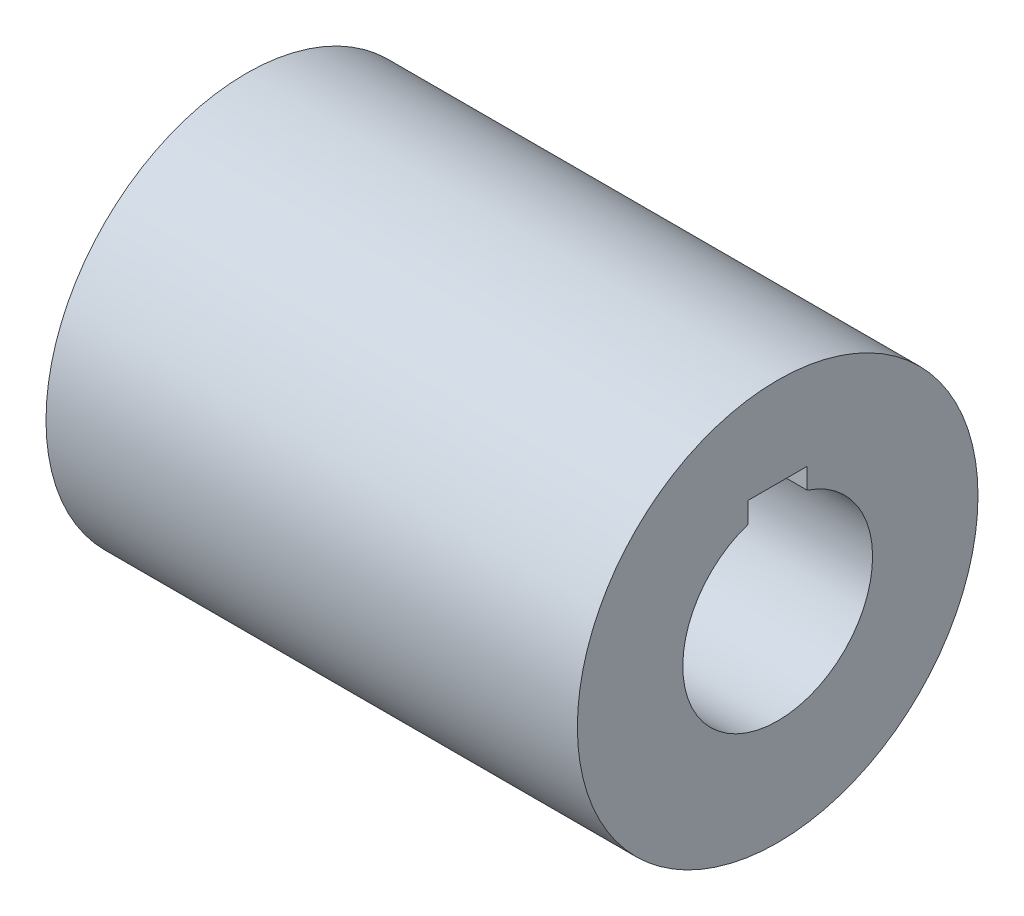
ISO-10303-21;
HEADER;
FILE_DESCRIPTION(('STEP AP214'),'2;1');
FILE_NAME('part.step','',(''),(''),'','','');
FILE_SCHEMA(('AUTOMOTIVE_DESIGN { 1 0 10303 214 1 1 1 1 }'));
ENDSEC;
DATA;
#1=APPLICATION_CONTEXT('core data for automotive mechanical design processes');
#2=APPLICATION_PROTOCOL_DEFINITION('international standard','automotive_design',2000,#1);
#3=PRODUCT_CONTEXT('',#1,'mechanical');
#4=PRODUCT('Part','Part','',(#3));
#5=PRODUCT_RELATED_PRODUCT_CATEGORY('part','',(#4));
#6=PRODUCT_DEFINITION_FORMATION('','',#4);
#7=PRODUCT_DEFINITION_CONTEXT('part definition',#1,'design');
#8=PRODUCT_DEFINITION('design','',#6,#7);
#9=PRODUCT_DEFINITION_SHAPE('','',#8);
#10=(LENGTH_UNIT() NAMED_UNIT(*) SI_UNIT(.MILLI.,.METRE.));
#11=(NAMED_UNIT(*) PLANE_ANGLE_UNIT() SI_UNIT($,.RADIAN.));
#12=(NAMED_UNIT(*) SI_UNIT($,.STERADIAN.) SOLID_ANGLE_UNIT());
#13=UNCERTAINTY_MEASURE_WITH_UNIT(LENGTH_MEASURE(1.E-05),#10,'distance_accuracy_value','');
#14=(GEOMETRIC_REPRESENTATION_CONTEXT(3) GLOBAL_UNCERTAINTY_ASSIGNED_CONTEXT((#13)) GLOBAL_UNIT_ASSIGNED_CONTEXT((#10,
#11,#12)) REPRESENTATION_CONTEXT('',''));
#15=CARTESIAN_POINT('',(0.,0.,0.));
#16=DIRECTION('',(0.,0.,1.));
#17=DIRECTION('',(1.,0.,0.));
#18=AXIS2_PLACEMENT_3D('',#15,#16,#17);
#19=CARTESIAN_POINT('',(63.,0.,0.));
#20=DIRECTION('',(1.,0.,0.));
#21=DIRECTION('',(0.,0.,-1.));
#22=AXIS2_PLACEMENT_3D('',#19,#20,#21);
#23=PLANE('',#22);
#24=CARTESIAN_POINT('',(63.,0.,0.));
#25=DIRECTION('',(1.,0.,0.));
#26=DIRECTION('',(0.,0.,-1.));
#27=AXIS2_PLACEMENT_3D('',#24,#25,#26);
#28=CIRCLE('',#27,47.5);
#29=CARTESIAN_POINT('',(63.,0.,-47.5));
#30=VERTEX_POINT('',#29);
#31=EDGE_CURVE('E11',#30,#30,#28,.T.);
#32=ORIENTED_EDGE('',*,*,#31,.T.);
#33=EDGE_LOOP('',(#32));
#34=FACE_BOUND('',#33,.T.);
#35=CARTESIAN_POINT('',(63.,0.,0.));
#36=DIRECTION('',(1.,0.,0.));
#37=DIRECTION('',(0.,0.,-1.));
#38=AXIS2_PLACEMENT_3D('',#35,#36,#37);
#39=CIRCLE('',#38,22.5);
#40=CARTESIAN_POINT('',(63.,21.3834047803431,7.));
#41=VERTEX_POINT('',#40);
#42=CARTESIAN_POINT('',(63.,21.3834047803431,-7.));
#43=VERTEX_POINT('',#42);
#44=EDGE_CURVE('E119',#41,#43,#39,.T.);
#45=ORIENTED_EDGE('',*,*,#44,.F.);
#46=DIRECTION('',(0.,-1.,0.));
#47=VECTOR('',#46,1.);
#48=CARTESIAN_POINT('',(63.,21.3834047803431,7.));
#49=LINE('',#48,#47);
#50=CARTESIAN_POINT('',(63.,26.3034047803431,7.));
#51=VERTEX_POINT('',#50);
#52=EDGE_CURVE('E108',#51,#41,#49,.T.);
#53=ORIENTED_EDGE('',*,*,#52,.F.);
#54=DIRECTION('',(0.,0.,1.));
#55=VECTOR('',#54,1.);
#56=CARTESIAN_POINT('',(63.,26.3034047803431,7.));
#57=LINE('',#56,#55);
#58=CARTESIAN_POINT('',(63.,26.3034047803431,-7.));
#59=VERTEX_POINT('',#58);
#60=EDGE_CURVE('E133',#59,#51,#57,.T.);
#61=ORIENTED_EDGE('',*,*,#60,.F.);
#62=DIRECTION('',(0.,1.,0.));
#63=VECTOR('',#62,1.);
#64=CARTESIAN_POINT('',(63.,26.3034047803431,-7.));
#65=LINE('',#64,#63);
#66=EDGE_CURVE('E131',#43,#59,#65,.T.);
#67=ORIENTED_EDGE('',*,*,#66,.F.);
#68=EDGE_LOOP('',(#45,#53,#61,#67));
#69=FACE_BOUND('',#68,.T.);
#70=ADVANCED_FACE('F41',(#34,#69),#23,.T.);
#71=CARTESIAN_POINT('',(63.,0.,0.));
#72=DIRECTION('',(-1.,0.,0.));
#73=DIRECTION('',(0.,0.,1.));
#74=AXIS2_PLACEMENT_3D('',#71,#72,#73);
#75=CYLINDRICAL_SURFACE('',#74,47.5);
#76=ORIENTED_EDGE('',*,*,#31,.F.);
#77=EDGE_LOOP('',(#76));
#78=FACE_BOUND('',#77,.T.);
#79=CARTESIAN_POINT('',(-63.,0.,0.));
#80=DIRECTION('',(1.,0.,0.));
#81=DIRECTION('',(0.,0.,-1.));
#82=AXIS2_PLACEMENT_3D('',#79,#80,#81);
#83=CIRCLE('',#82,47.5);
#84=CARTESIAN_POINT('',(-63.,0.,-47.5));
#85=VERTEX_POINT('',#84);
#86=EDGE_CURVE('E45',#85,#85,#83,.T.);
#87=ORIENTED_EDGE('',*,*,#86,.T.);
#88=EDGE_LOOP('',(#87));
#89=FACE_BOUND('',#88,.T.);
#90=ADVANCED_FACE('F43',(#78,#89),#75,.T.);
#91=CARTESIAN_POINT('',(-63.,0.,0.));
#92=DIRECTION('',(1.,0.,0.));
#93=DIRECTION('',(0.,0.,-1.));
#94=AXIS2_PLACEMENT_3D('',#91,#92,#93);
#95=PLANE('',#94);
#96=DIRECTION('',(0.,-1.,0.));
#97=VECTOR('',#96,1.);
#98=CARTESIAN_POINT('',(-63.,26.3106442338457,8.));
#99=LINE('',#98,#97);
#100=CARTESIAN_POINT('',(-63.,31.8,8.));
#101=VERTEX_POINT('',#100);
#102=CARTESIAN_POINT('',(-63.,26.3106442338457,8.));
#103=VERTEX_POINT('',#102);
#104=EDGE_CURVE('E154',#101,#103,#99,.T.);
#105=ORIENTED_EDGE('',*,*,#104,.T.);
#106=CARTESIAN_POINT('',(-63.,0.,0.));
#107=DIRECTION('',(1.,0.,0.));
#108=DIRECTION('',(0.,0.,-1.));
#109=AXIS2_PLACEMENT_3D('',#106,#107,#108);
#110=CIRCLE('',#109,27.5);
#111=CARTESIAN_POINT('',(-63.,26.3106442338457,-8.));
#112=VERTEX_POINT('',#111);
#113=EDGE_CURVE('E146',#103,#112,#110,.T.);
#114=ORIENTED_EDGE('',*,*,#113,.T.);
#115=DIRECTION('',(0.,1.,0.));
#116=VECTOR('',#115,1.);
#117=CARTESIAN_POINT('',(-63.,31.8,-8.));
#118=LINE('',#117,#116);
#119=CARTESIAN_POINT('',(-63.,31.8,-8.));
#120=VERTEX_POINT('',#119);
#121=EDGE_CURVE('E149',#112,#120,#118,.T.);
#122=ORIENTED_EDGE('',*,*,#121,.T.);
#123=DIRECTION('',(0.,0.,1.));
#124=VECTOR('',#123,1.);
#125=CARTESIAN_POINT('',(-63.,31.8,8.));
#126=LINE('',#125,#124);
#127=EDGE_CURVE('E64',#120,#101,#126,.T.);
#128=ORIENTED_EDGE('',*,*,#127,.T.);
#129=EDGE_LOOP('',(#105,#114,#122,#128));
#130=FACE_BOUND('',#129,.T.);
#131=ORIENTED_EDGE('',*,*,#86,.F.);
#132=EDGE_LOOP('',(#131));
#133=FACE_BOUND('',#132,.T.);
#134=ADVANCED_FACE('F191',(#130,#133),#95,.F.);
#135=CARTESIAN_POINT('',(-63.,0.,0.));
#136=DIRECTION('',(1.,0.,0.));
#137=DIRECTION('',(0.,0.,-1.));
#138=AXIS2_PLACEMENT_3D('',#135,#136,#137);
#139=CYLINDRICAL_SURFACE('',#138,27.5);
#140=CARTESIAN_POINT('',(-13.,0.,0.));
#141=DIRECTION('',(1.,0.,0.));
#142=DIRECTION('',(0.,0.,-1.));
#143=AXIS2_PLACEMENT_3D('',#140,#141,#142);
#144=CIRCLE('',#143,27.5);
#145=CARTESIAN_POINT('',(-13.,26.3106442338457,8.));
#146=VERTEX_POINT('',#145);
#147=CARTESIAN_POINT('',(-13.,26.3106442338457,-8.));
#148=VERTEX_POINT('',#147);
#149=EDGE_CURVE('E127',#146,#148,#144,.T.);
#150=ORIENTED_EDGE('',*,*,#149,.T.);
#151=DIRECTION('',(1.,0.,0.));
#152=VECTOR('',#151,1.);
#153=CARTESIAN_POINT('',(-63.,26.3106442338457,-8.));
#154=LINE('',#153,#152);
#155=EDGE_CURVE('E157',#112,#148,#154,.T.);
#156=ORIENTED_EDGE('',*,*,#155,.F.);
#157=ORIENTED_EDGE('',*,*,#113,.F.);
#158=DIRECTION('',(1.,0.,0.));
#159=VECTOR('',#158,1.);
#160=CARTESIAN_POINT('',(-63.,26.3106442338457,8.));
#161=LINE('',#160,#159);
#162=EDGE_CURVE('E168',#103,#146,#161,.T.);
#163=ORIENTED_EDGE('',*,*,#162,.T.);
#164=EDGE_LOOP('',(#150,#156,#157,#163));
#165=FACE_BOUND('',#164,.T.);
#166=ADVANCED_FACE('F185',(#165),#139,.F.);
#167=CARTESIAN_POINT('',(-63.,26.3106442338457,8.));
#168=DIRECTION('',(0.,0.,1.));
#169=DIRECTION('',(1.,0.,0.));
#170=AXIS2_PLACEMENT_3D('',#167,#168,#169);
#171=PLANE('',#170);
#172=DIRECTION('',(0.,-1.,0.));
#173=VECTOR('',#172,1.);
#174=CARTESIAN_POINT('',(-13.,26.3106442338457,8.));
#175=LINE('',#174,#173);
#176=CARTESIAN_POINT('',(-13.,31.8,8.));
#177=VERTEX_POINT('',#176);
#178=EDGE_CURVE('E150',#177,#146,#175,.T.);
#179=ORIENTED_EDGE('',*,*,#178,.T.);
#180=ORIENTED_EDGE('',*,*,#162,.F.);
#181=ORIENTED_EDGE('',*,*,#104,.F.);
#182=DIRECTION('',(1.,0.,0.));
#183=VECTOR('',#182,1.);
#184=CARTESIAN_POINT('',(-63.,31.8,8.));
#185=LINE('',#184,#183);
#186=EDGE_CURVE('E170',#101,#177,#185,.T.);
#187=ORIENTED_EDGE('',*,*,#186,.T.);
#188=EDGE_LOOP('',(#179,#180,#181,#187));
#189=FACE_BOUND('',#188,.T.);
#190=ADVANCED_FACE('F188',(#189),#171,.F.);
#191=CARTESIAN_POINT('',(-63.,31.8,8.));
#192=DIRECTION('',(0.,1.,0.));
#193=DIRECTION('',(0.,0.,1.));
#194=AXIS2_PLACEMENT_3D('',#191,#192,#193);
#195=PLANE('',#194);
#196=DIRECTION('',(0.,0.,1.));
#197=VECTOR('',#196,1.);
#198=CARTESIAN_POINT('',(-13.,31.8,8.));
#199=LINE('',#198,#197);
#200=CARTESIAN_POINT('',(-13.,31.8,-8.));
#201=VERTEX_POINT('',#200);
#202=EDGE_CURVE('E163',#201,#177,#199,.T.);
#203=ORIENTED_EDGE('',*,*,#202,.T.);
#204=ORIENTED_EDGE('',*,*,#186,.F.);
#205=ORIENTED_EDGE('',*,*,#127,.F.);
#206=DIRECTION('',(1.,0.,0.));
#207=VECTOR('',#206,1.);
#208=CARTESIAN_POINT('',(-63.,31.8,-8.));
#209=LINE('',#208,#207);
#210=EDGE_CURVE('E172',#120,#201,#209,.T.);
#211=ORIENTED_EDGE('',*,*,#210,.T.);
#212=EDGE_LOOP('',(#203,#204,#205,#211));
#213=FACE_BOUND('',#212,.T.);
#214=ADVANCED_FACE('F189',(#213),#195,.F.);
#215=CARTESIAN_POINT('',(-63.,31.8,-8.));
#216=DIRECTION('',(0.,0.,-1.));
#217=DIRECTION('',(-1.,0.,0.));
#218=AXIS2_PLACEMENT_3D('',#215,#216,#217);
#219=PLANE('',#218);
#220=DIRECTION('',(0.,1.,0.));
#221=VECTOR('',#220,1.);
#222=CARTESIAN_POINT('',(-13.,31.8,-8.));
#223=LINE('',#222,#221);
#224=EDGE_CURVE('E160',#148,#201,#223,.T.);
#225=ORIENTED_EDGE('',*,*,#224,.T.);
#226=ORIENTED_EDGE('',*,*,#210,.F.);
#227=ORIENTED_EDGE('',*,*,#121,.F.);
#228=ORIENTED_EDGE('',*,*,#155,.T.);
#229=EDGE_LOOP('',(#225,#226,#227,#228));
#230=FACE_BOUND('',#229,.T.);
#231=ADVANCED_FACE('F177',(#230),#219,.F.);
#232=CARTESIAN_POINT('',(-13.,0.,0.));
#233=DIRECTION('',(1.,0.,0.));
#234=DIRECTION('',(0.,0.,-1.));
#235=AXIS2_PLACEMENT_3D('',#232,#233,#234);
#236=PLANE('',#235);
#237=ORIENTED_EDGE('',*,*,#149,.F.);
#238=ORIENTED_EDGE('',*,*,#178,.F.);
#239=ORIENTED_EDGE('',*,*,#202,.F.);
#240=ORIENTED_EDGE('',*,*,#224,.F.);
#241=EDGE_LOOP('',(#237,#238,#239,#240));
#242=FACE_BOUND('',#241,.T.);
#243=ADVANCED_FACE('F183',(#242),#236,.F.);
#244=CARTESIAN_POINT('',(63.,21.3834047803431,7.));
#245=DIRECTION('',(0.,0.,-1.));
#246=DIRECTION('',(-1.,0.,0.));
#247=AXIS2_PLACEMENT_3D('',#244,#245,#246);
#248=PLANE('',#247);
#249=DIRECTION('',(0.,-1.,0.));
#250=VECTOR('',#249,1.);
#251=CARTESIAN_POINT('',(13.,21.3834047803431,7.));
#252=LINE('',#251,#250);
#253=CARTESIAN_POINT('',(13.,26.3034047803431,7.));
#254=VERTEX_POINT('',#253);
#255=CARTESIAN_POINT('',(13.,21.3834047803431,7.));
#256=VERTEX_POINT('',#255);
#257=EDGE_CURVE('E137',#254,#256,#252,.T.);
#258=ORIENTED_EDGE('',*,*,#257,.F.);
#259=DIRECTION('',(-1.,0.,0.));
#260=VECTOR('',#259,1.);
#261=CARTESIAN_POINT('',(63.,26.3034047803431,7.));
#262=LINE('',#261,#260);
#263=EDGE_CURVE('E115',#51,#254,#262,.T.);
#264=ORIENTED_EDGE('',*,*,#263,.F.);
#265=ORIENTED_EDGE('',*,*,#52,.T.);
#266=DIRECTION('',(-1.,0.,0.));
#267=VECTOR('',#266,1.);
#268=CARTESIAN_POINT('',(63.,21.3834047803431,7.));
#269=LINE('',#268,#267);
#270=EDGE_CURVE('E112',#41,#256,#269,.T.);
#271=ORIENTED_EDGE('',*,*,#270,.T.);
#272=EDGE_LOOP('',(#258,#264,#265,#271));
#273=FACE_BOUND('',#272,.T.);
#274=ADVANCED_FACE('F111',(#273),#248,.T.);
#275=CARTESIAN_POINT('',(63.,0.,0.));
#276=DIRECTION('',(-1.,0.,0.));
#277=DIRECTION('',(0.,0.,1.));
#278=AXIS2_PLACEMENT_3D('',#275,#276,#277);
#279=CYLINDRICAL_SURFACE('',#278,22.5);
#280=CARTESIAN_POINT('',(13.,0.,0.));
#281=DIRECTION('',(1.,0.,0.));
#282=DIRECTION('',(0.,0.,-1.));
#283=AXIS2_PLACEMENT_3D('',#280,#281,#282);
#284=CIRCLE('',#283,22.5);
#285=CARTESIAN_POINT('',(13.,21.3834047803431,-7.));
#286=VERTEX_POINT('',#285);
#287=EDGE_CURVE('E126',#256,#286,#284,.T.);
#288=ORIENTED_EDGE('',*,*,#287,.F.);
#289=ORIENTED_EDGE('',*,*,#270,.F.);
#290=ORIENTED_EDGE('',*,*,#44,.T.);
#291=DIRECTION('',(-1.,0.,0.));
#292=VECTOR('',#291,1.);
#293=CARTESIAN_POINT('',(63.,21.3834047803431,-7.));
#294=LINE('',#293,#292);
#295=EDGE_CURVE('E128',#43,#286,#294,.T.);
#296=ORIENTED_EDGE('',*,*,#295,.T.);
#297=EDGE_LOOP('',(#288,#289,#290,#296));
#298=FACE_BOUND('',#297,.T.);
#299=ADVANCED_FACE('F123',(#298),#279,.F.);
#300=CARTESIAN_POINT('',(63.,26.3034047803431,-7.));
#301=DIRECTION('',(0.,0.,1.));
#302=DIRECTION('',(1.,0.,0.));
#303=AXIS2_PLACEMENT_3D('',#300,#301,#302);
#304=PLANE('',#303);
#305=DIRECTION('',(0.,1.,0.));
#306=VECTOR('',#305,1.);
#307=CARTESIAN_POINT('',(13.,26.3034047803431,-7.));
#308=LINE('',#307,#306);
#309=CARTESIAN_POINT('',(13.,26.3034047803431,-7.));
#310=VERTEX_POINT('',#309);
#311=EDGE_CURVE('E140',#286,#310,#308,.T.);
#312=ORIENTED_EDGE('',*,*,#311,.F.);
#313=ORIENTED_EDGE('',*,*,#295,.F.);
#314=ORIENTED_EDGE('',*,*,#66,.T.);
#315=DIRECTION('',(-1.,0.,0.));
#316=VECTOR('',#315,1.);
#317=CARTESIAN_POINT('',(63.,26.3034047803431,-7.));
#318=LINE('',#317,#316);
#319=EDGE_CURVE('E56',#59,#310,#318,.T.);
#320=ORIENTED_EDGE('',*,*,#319,.T.);
#321=EDGE_LOOP('',(#312,#313,#314,#320));
#322=FACE_BOUND('',#321,.T.);
#323=ADVANCED_FACE('F222',(#322),#304,.T.);
#324=CARTESIAN_POINT('',(63.,26.3034047803431,7.));
#325=DIRECTION('',(0.,-1.,0.));
#326=DIRECTION('',(0.,0.,-1.));
#327=AXIS2_PLACEMENT_3D('',#324,#325,#326);
#328=PLANE('',#327);
#329=DIRECTION('',(0.,0.,1.));
#330=VECTOR('',#329,1.);
#331=CARTESIAN_POINT('',(13.,26.3034047803431,7.));
#332=LINE('',#331,#330);
#333=EDGE_CURVE('E120',#310,#254,#332,.T.);
#334=ORIENTED_EDGE('',*,*,#333,.F.);
#335=ORIENTED_EDGE('',*,*,#319,.F.);
#336=ORIENTED_EDGE('',*,*,#60,.T.);
#337=ORIENTED_EDGE('',*,*,#263,.T.);
#338=EDGE_LOOP('',(#334,#335,#336,#337));
#339=FACE_BOUND('',#338,.T.);
#340=ADVANCED_FACE('F225',(#339),#328,.T.);
#341=CARTESIAN_POINT('',(13.,0.,0.));
#342=DIRECTION('',(1.,0.,0.));
#343=DIRECTION('',(0.,0.,-1.));
#344=AXIS2_PLACEMENT_3D('',#341,#342,#343);
#345=PLANE('',#344);
#346=ORIENTED_EDGE('',*,*,#257,.T.);
#347=ORIENTED_EDGE('',*,*,#287,.T.);
#348=ORIENTED_EDGE('',*,*,#311,.T.);
#349=ORIENTED_EDGE('',*,*,#333,.T.);
#350=EDGE_LOOP('',(#346,#347,#348,#349));
#351=FACE_BOUND('',#350,.T.);
#352=ADVANCED_FACE('F229',(#351),#345,.T.);
#353=CLOSED_SHELL('',(#70,#90,#134,#166,#190,#214,#231,#243,#274,#299,#323,#340,#352));
#354=MANIFOLD_SOLID_BREP('B2',#353);
#355=ADVANCED_BREP_SHAPE_REPRESENTATION('',(#18,#354),#14);
#356=SHAPE_DEFINITION_REPRESENTATION(#9,#355);
ENDSEC;
END-ISO-10303-21;
